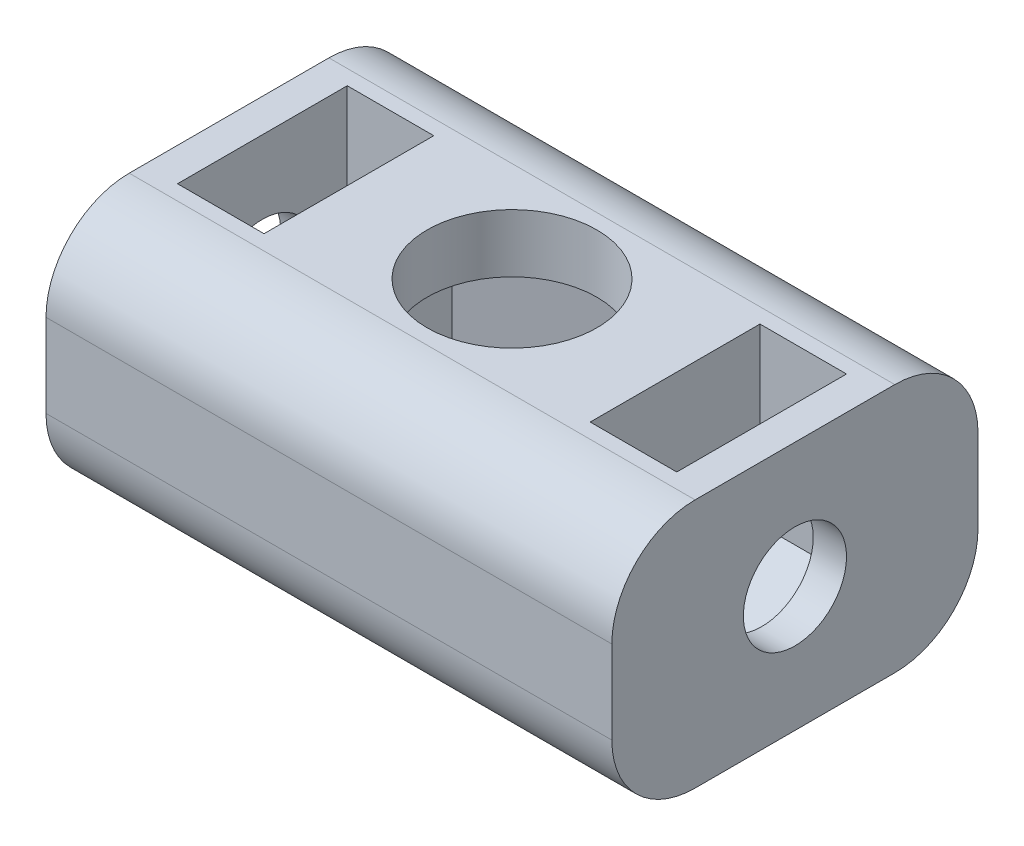
ISO-10303-21;
HEADER;
FILE_DESCRIPTION(('STEP AP214'),'2;1');
FILE_NAME('part.step','',(''),(''),'','','');
FILE_SCHEMA(('AUTOMOTIVE_DESIGN { 1 0 10303 214 1 1 1 1 }'));
ENDSEC;
DATA;
#1=APPLICATION_CONTEXT('core data for automotive mechanical design processes');
#2=APPLICATION_PROTOCOL_DEFINITION('international standard','automotive_design',2000,#1);
#3=PRODUCT_CONTEXT('',#1,'mechanical');
#4=PRODUCT('Part','Part','',(#3));
#5=PRODUCT_RELATED_PRODUCT_CATEGORY('part','',(#4));
#6=PRODUCT_DEFINITION_FORMATION('','',#4);
#7=PRODUCT_DEFINITION_CONTEXT('part definition',#1,'design');
#8=PRODUCT_DEFINITION('design','',#6,#7);
#9=PRODUCT_DEFINITION_SHAPE('','',#8);
#10=(LENGTH_UNIT() NAMED_UNIT(*) SI_UNIT(.MILLI.,.METRE.));
#11=(NAMED_UNIT(*) PLANE_ANGLE_UNIT() SI_UNIT($,.RADIAN.));
#12=(NAMED_UNIT(*) SI_UNIT($,.STERADIAN.) SOLID_ANGLE_UNIT());
#13=UNCERTAINTY_MEASURE_WITH_UNIT(LENGTH_MEASURE(1.E-05),#10,'distance_accuracy_value','');
#14=(GEOMETRIC_REPRESENTATION_CONTEXT(3) GLOBAL_UNCERTAINTY_ASSIGNED_CONTEXT((#13)) GLOBAL_UNIT_ASSIGNED_CONTEXT((#10,
#11,#12)) REPRESENTATION_CONTEXT('',''));
#15=CARTESIAN_POINT('',(0.,0.,0.));
#16=DIRECTION('',(0.,0.,1.));
#17=DIRECTION('',(1.,0.,0.));
#18=AXIS2_PLACEMENT_3D('',#15,#16,#17);
#19=CARTESIAN_POINT('',(17.,15.,-11.));
#20=DIRECTION('',(0.,-1.,0.));
#21=DIRECTION('',(0.,0.,-1.));
#22=AXIS2_PLACEMENT_3D('',#19,#20,#21);
#23=CYLINDRICAL_SURFACE('',#22,5.1);
#24=CARTESIAN_POINT('',(17.,0.,-11.));
#25=DIRECTION('',(0.,1.,0.));
#26=DIRECTION('',(0.,0.,1.));
#27=AXIS2_PLACEMENT_3D('',#24,#25,#26);
#28=CIRCLE('',#27,5.1);
#29=CARTESIAN_POINT('',(17.,0.,-5.9));
#30=VERTEX_POINT('',#29);
#31=EDGE_CURVE('E384',#30,#30,#28,.T.);
#32=ORIENTED_EDGE('',*,*,#31,.F.);
#33=EDGE_LOOP('',(#32));
#34=FACE_BOUND('',#33,.T.);
#35=CARTESIAN_POINT('',(17.,3.5,-11.));
#36=DIRECTION('',(0.,1.,0.));
#37=DIRECTION('',(0.,0.,1.));
#38=AXIS2_PLACEMENT_3D('',#35,#36,#37);
#39=CIRCLE('',#38,5.1);
#40=CARTESIAN_POINT('',(17.,3.5,-5.9));
#41=VERTEX_POINT('',#40);
#42=EDGE_CURVE('E215',#41,#41,#39,.T.);
#43=ORIENTED_EDGE('',*,*,#42,.T.);
#44=EDGE_LOOP('',(#43));
#45=FACE_BOUND('',#44,.T.);
#46=ADVANCED_FACE('F39',(#34,#45),#23,.F.);
#47=CARTESIAN_POINT('',(0.,15.,0.));
#48=DIRECTION('',(0.,-1.,0.));
#49=DIRECTION('',(0.,0.,-1.));
#50=AXIS2_PLACEMENT_3D('',#47,#48,#49);
#51=PLANE('',#50);
#52=DIRECTION('',(0.,0.,-1.));
#53=VECTOR('',#52,1.);
#54=CARTESIAN_POINT('',(7.19999999999999,15.,-16.1));
#55=LINE('',#54,#53);
#56=CARTESIAN_POINT('',(7.2,15.,-5.9));
#57=VERTEX_POINT('',#56);
#58=CARTESIAN_POINT('',(7.19999999999999,15.,-16.1));
#59=VERTEX_POINT('',#58);
#60=EDGE_CURVE('E355',#57,#59,#55,.T.);
#61=ORIENTED_EDGE('',*,*,#60,.F.);
#62=DIRECTION('',(-1.,0.,0.));
#63=VECTOR('',#62,1.);
#64=CARTESIAN_POINT('',(7.2,15.,-5.9));
#65=LINE('',#64,#63);
#66=CARTESIAN_POINT('',(2.,15.,-5.9));
#67=VERTEX_POINT('',#66);
#68=EDGE_CURVE('E388',#57,#67,#65,.T.);
#69=ORIENTED_EDGE('',*,*,#68,.T.);
#70=DIRECTION('',(0.,0.,-1.));
#71=VECTOR('',#70,1.);
#72=CARTESIAN_POINT('',(1.99999999999999,15.,-16.1));
#73=LINE('',#72,#71);
#74=CARTESIAN_POINT('',(1.99999999999999,15.,-16.1));
#75=VERTEX_POINT('',#74);
#76=EDGE_CURVE('E374',#67,#75,#73,.T.);
#77=ORIENTED_EDGE('',*,*,#76,.T.);
#78=DIRECTION('',(-1.,0.,0.));
#79=VECTOR('',#78,1.);
#80=CARTESIAN_POINT('',(7.19999999999999,15.,-16.1));
#81=LINE('',#80,#79);
#82=EDGE_CURVE('E385',#59,#75,#81,.T.);
#83=ORIENTED_EDGE('',*,*,#82,.F.);
#84=EDGE_LOOP('',(#61,#69,#77,#83));
#85=FACE_BOUND('',#84,.T.);
#86=DIRECTION('',(0.,0.,1.));
#87=VECTOR('',#86,1.);
#88=CARTESIAN_POINT('',(0.,15.,0.));
#89=LINE('',#88,#87);
#90=CARTESIAN_POINT('',(0.,15.,-17.));
#91=VERTEX_POINT('',#90);
#92=CARTESIAN_POINT('',(0.,15.,-5.));
#93=VERTEX_POINT('',#92);
#94=EDGE_CURVE('E406',#91,#93,#89,.T.);
#95=ORIENTED_EDGE('',*,*,#94,.T.);
#96=DIRECTION('',(1.,0.,0.));
#97=VECTOR('',#96,1.);
#98=CARTESIAN_POINT('',(0.,15.,-5.));
#99=LINE('',#98,#97);
#100=CARTESIAN_POINT('',(34.,15.,-5.));
#101=VERTEX_POINT('',#100);
#102=EDGE_CURVE('E11',#93,#101,#99,.T.);
#103=ORIENTED_EDGE('',*,*,#102,.T.);
#104=DIRECTION('',(0.,0.,-1.));
#105=VECTOR('',#104,1.);
#106=CARTESIAN_POINT('',(34.,15.,0.));
#107=LINE('',#106,#105);
#108=CARTESIAN_POINT('',(34.,15.,-17.));
#109=VERTEX_POINT('',#108);
#110=EDGE_CURVE('E410',#101,#109,#107,.T.);
#111=ORIENTED_EDGE('',*,*,#110,.T.);
#112=DIRECTION('',(-1.,0.,0.));
#113=VECTOR('',#112,1.);
#114=CARTESIAN_POINT('',(0.,15.,-17.));
#115=LINE('',#114,#113);
#116=EDGE_CURVE('E48',#109,#91,#115,.T.);
#117=ORIENTED_EDGE('',*,*,#116,.T.);
#118=EDGE_LOOP('',(#95,#103,#111,#117));
#119=FACE_BOUND('',#118,.T.);
#120=CARTESIAN_POINT('',(17.,15.,-11.));
#121=DIRECTION('',(0.,1.,0.));
#122=DIRECTION('',(0.,0.,1.));
#123=AXIS2_PLACEMENT_3D('',#120,#121,#122);
#124=CIRCLE('',#123,5.1);
#125=CARTESIAN_POINT('',(17.,15.,-5.9));
#126=VERTEX_POINT('',#125);
#127=EDGE_CURVE('E398',#126,#126,#124,.T.);
#128=ORIENTED_EDGE('',*,*,#127,.F.);
#129=EDGE_LOOP('',(#128));
#130=FACE_BOUND('',#129,.T.);
#131=DIRECTION('',(0.,0.,1.));
#132=VECTOR('',#131,1.);
#133=CARTESIAN_POINT('',(26.8,15.,-5.9));
#134=LINE('',#133,#132);
#135=CARTESIAN_POINT('',(26.8,15.,-16.1));
#136=VERTEX_POINT('',#135);
#137=CARTESIAN_POINT('',(26.8,15.,-5.9));
#138=VERTEX_POINT('',#137);
#139=EDGE_CURVE('E284',#136,#138,#134,.T.);
#140=ORIENTED_EDGE('',*,*,#139,.F.);
#141=DIRECTION('',(1.,0.,0.));
#142=VECTOR('',#141,1.);
#143=CARTESIAN_POINT('',(26.8,15.,-16.1));
#144=LINE('',#143,#142);
#145=CARTESIAN_POINT('',(32.,15.,-16.1));
#146=VERTEX_POINT('',#145);
#147=EDGE_CURVE('E326',#136,#146,#144,.T.);
#148=ORIENTED_EDGE('',*,*,#147,.T.);
#149=DIRECTION('',(0.,0.,1.));
#150=VECTOR('',#149,1.);
#151=CARTESIAN_POINT('',(32.,15.,-5.9));
#152=LINE('',#151,#150);
#153=CARTESIAN_POINT('',(32.,15.,-5.9));
#154=VERTEX_POINT('',#153);
#155=EDGE_CURVE('E306',#146,#154,#152,.T.);
#156=ORIENTED_EDGE('',*,*,#155,.T.);
#157=DIRECTION('',(1.,0.,0.));
#158=VECTOR('',#157,1.);
#159=CARTESIAN_POINT('',(26.8,15.,-5.9));
#160=LINE('',#159,#158);
#161=EDGE_CURVE('E305',#138,#154,#160,.T.);
#162=ORIENTED_EDGE('',*,*,#161,.F.);
#163=EDGE_LOOP('',(#140,#148,#156,#162));
#164=FACE_BOUND('',#163,.T.);
#165=ADVANCED_FACE('F491',(#85,#119,#130,#164),#51,.F.);
#166=CARTESIAN_POINT('',(0.,0.,0.));
#167=DIRECTION('',(0.,-1.,0.));
#168=DIRECTION('',(0.,0.,-1.));
#169=AXIS2_PLACEMENT_3D('',#166,#167,#168);
#170=PLANE('',#169);
#171=DIRECTION('',(0.,0.,-1.));
#172=VECTOR('',#171,1.);
#173=CARTESIAN_POINT('',(34.,0.,0.));
#174=LINE('',#173,#172);
#175=CARTESIAN_POINT('',(34.,0.,-5.));
#176=VERTEX_POINT('',#175);
#177=CARTESIAN_POINT('',(34.,0.,-17.));
#178=VERTEX_POINT('',#177);
#179=EDGE_CURVE('E411',#176,#178,#174,.T.);
#180=ORIENTED_EDGE('',*,*,#179,.F.);
#181=DIRECTION('',(1.,0.,0.));
#182=VECTOR('',#181,1.);
#183=CARTESIAN_POINT('',(0.,0.,-5.));
#184=LINE('',#183,#182);
#185=CARTESIAN_POINT('',(0.,0.,-5.));
#186=VERTEX_POINT('',#185);
#187=EDGE_CURVE('E469',#176,#186,#184,.F.);
#188=ORIENTED_EDGE('',*,*,#187,.T.);
#189=DIRECTION('',(0.,0.,1.));
#190=VECTOR('',#189,1.);
#191=CARTESIAN_POINT('',(0.,0.,0.));
#192=LINE('',#191,#190);
#193=CARTESIAN_POINT('',(0.,0.,-17.));
#194=VERTEX_POINT('',#193);
#195=EDGE_CURVE('E402',#194,#186,#192,.T.);
#196=ORIENTED_EDGE('',*,*,#195,.F.);
#197=DIRECTION('',(-1.,0.,0.));
#198=VECTOR('',#197,1.);
#199=CARTESIAN_POINT('',(34.,0.,-17.));
#200=LINE('',#199,#198);
#201=EDGE_CURVE('E466',#194,#178,#200,.F.);
#202=ORIENTED_EDGE('',*,*,#201,.T.);
#203=EDGE_LOOP('',(#180,#188,#196,#202));
#204=FACE_BOUND('',#203,.T.);
#205=ORIENTED_EDGE('',*,*,#31,.T.);
#206=EDGE_LOOP('',(#205));
#207=FACE_BOUND('',#206,.T.);
#208=ADVANCED_FACE('F514',(#204,#207),#170,.T.);
#209=CARTESIAN_POINT('',(0.,15.,0.));
#210=DIRECTION('',(1.,0.,0.));
#211=DIRECTION('',(0.,0.,-1.));
#212=AXIS2_PLACEMENT_3D('',#209,#210,#211);
#213=PLANE('',#212);
#214=CARTESIAN_POINT('',(0.,7.5,-11.));
#215=DIRECTION('',(-1.,0.,0.));
#216=DIRECTION('',(0.,0.,1.));
#217=AXIS2_PLACEMENT_3D('',#214,#215,#216);
#218=CIRCLE('',#217,3.1);
#219=CARTESIAN_POINT('',(0.,7.5,-7.89999999999999));
#220=VERTEX_POINT('',#219);
#221=EDGE_CURVE('E447',#220,#220,#218,.T.);
#222=ORIENTED_EDGE('',*,*,#221,.F.);
#223=EDGE_LOOP('',(#222));
#224=FACE_BOUND('',#223,.T.);
#225=ORIENTED_EDGE('',*,*,#195,.T.);
#226=CARTESIAN_POINT('',(0.,5.,-5.));
#227=DIRECTION('',(1.,0.,0.));
#228=DIRECTION('',(0.,0.,-1.));
#229=AXIS2_PLACEMENT_3D('',#226,#227,#228);
#230=CIRCLE('',#229,5.);
#231=CARTESIAN_POINT('',(0.,5.,0.));
#232=VERTEX_POINT('',#231);
#233=EDGE_CURVE('E479',#186,#232,#230,.F.);
#234=ORIENTED_EDGE('',*,*,#233,.T.);
#235=DIRECTION('',(0.,-1.,0.));
#236=VECTOR('',#235,1.);
#237=CARTESIAN_POINT('',(0.,15.,0.));
#238=LINE('',#237,#236);
#239=CARTESIAN_POINT('',(0.,10.,0.));
#240=VERTEX_POINT('',#239);
#241=EDGE_CURVE('E432',#240,#232,#238,.T.);
#242=ORIENTED_EDGE('',*,*,#241,.F.);
#243=CARTESIAN_POINT('',(0.,10.,-5.));
#244=DIRECTION('',(1.,0.,0.));
#245=DIRECTION('',(0.,0.,-1.));
#246=AXIS2_PLACEMENT_3D('',#243,#244,#245);
#247=CIRCLE('',#246,5.);
#248=EDGE_CURVE('E474',#240,#93,#247,.F.);
#249=ORIENTED_EDGE('',*,*,#248,.T.);
#250=ORIENTED_EDGE('',*,*,#94,.F.);
#251=CARTESIAN_POINT('',(0.,10.,-17.));
#252=DIRECTION('',(1.,0.,0.));
#253=DIRECTION('',(0.,0.,-1.));
#254=AXIS2_PLACEMENT_3D('',#251,#252,#253);
#255=CIRCLE('',#254,5.);
#256=CARTESIAN_POINT('',(0.,10.,-22.));
#257=VERTEX_POINT('',#256);
#258=EDGE_CURVE('E63',#91,#257,#255,.F.);
#259=ORIENTED_EDGE('',*,*,#258,.T.);
#260=DIRECTION('',(0.,-1.,0.));
#261=VECTOR('',#260,1.);
#262=CARTESIAN_POINT('',(0.,15.,-22.));
#263=LINE('',#262,#261);
#264=CARTESIAN_POINT('',(0.,5.,-22.));
#265=VERTEX_POINT('',#264);
#266=EDGE_CURVE('E415',#257,#265,#263,.T.);
#267=ORIENTED_EDGE('',*,*,#266,.T.);
#268=CARTESIAN_POINT('',(0.,5.,-17.));
#269=DIRECTION('',(1.,0.,0.));
#270=DIRECTION('',(0.,0.,-1.));
#271=AXIS2_PLACEMENT_3D('',#268,#269,#270);
#272=CIRCLE('',#271,5.);
#273=EDGE_CURVE('E55',#265,#194,#272,.F.);
#274=ORIENTED_EDGE('',*,*,#273,.T.);
#275=EDGE_LOOP('',(#225,#234,#242,#249,#250,#259,#267,#274));
#276=FACE_BOUND('',#275,.T.);
#277=ADVANCED_FACE('F497',(#224,#276),#213,.F.);
#278=CARTESIAN_POINT('',(0.,15.,0.));
#279=DIRECTION('',(0.,0.,-1.));
#280=DIRECTION('',(-1.,0.,0.));
#281=AXIS2_PLACEMENT_3D('',#278,#279,#280);
#282=PLANE('',#281);
#283=ORIENTED_EDGE('',*,*,#241,.T.);
#284=DIRECTION('',(1.,0.,0.));
#285=VECTOR('',#284,1.);
#286=CARTESIAN_POINT('',(34.,5.,0.));
#287=LINE('',#286,#285);
#288=CARTESIAN_POINT('',(34.,5.,0.));
#289=VERTEX_POINT('',#288);
#290=EDGE_CURVE('E450',#232,#289,#287,.T.);
#291=ORIENTED_EDGE('',*,*,#290,.T.);
#292=DIRECTION('',(0.,-1.,0.));
#293=VECTOR('',#292,1.);
#294=CARTESIAN_POINT('',(34.,15.,0.));
#295=LINE('',#294,#293);
#296=CARTESIAN_POINT('',(34.,10.,0.));
#297=VERTEX_POINT('',#296);
#298=EDGE_CURVE('E428',#297,#289,#295,.T.);
#299=ORIENTED_EDGE('',*,*,#298,.F.);
#300=DIRECTION('',(1.,0.,0.));
#301=VECTOR('',#300,1.);
#302=CARTESIAN_POINT('',(0.,10.,0.));
#303=LINE('',#302,#301);
#304=EDGE_CURVE('E436',#297,#240,#303,.F.);
#305=ORIENTED_EDGE('',*,*,#304,.T.);
#306=EDGE_LOOP('',(#283,#291,#299,#305));
#307=FACE_BOUND('',#306,.T.);
#308=ADVANCED_FACE('F523',(#307),#282,.F.);
#309=CARTESIAN_POINT('',(34.,15.,0.));
#310=DIRECTION('',(-1.,0.,0.));
#311=DIRECTION('',(0.,0.,1.));
#312=AXIS2_PLACEMENT_3D('',#309,#310,#311);
#313=PLANE('',#312);
#314=CARTESIAN_POINT('',(34.,7.5,-11.));
#315=DIRECTION('',(1.,0.,0.));
#316=DIRECTION('',(0.,0.,-1.));
#317=AXIS2_PLACEMENT_3D('',#314,#315,#316);
#318=CIRCLE('',#317,3.1);
#319=CARTESIAN_POINT('',(34.,7.5,-14.1));
#320=VERTEX_POINT('',#319);
#321=EDGE_CURVE('E237',#320,#320,#318,.T.);
#322=ORIENTED_EDGE('',*,*,#321,.F.);
#323=EDGE_LOOP('',(#322));
#324=FACE_BOUND('',#323,.T.);
#325=ORIENTED_EDGE('',*,*,#298,.T.);
#326=CARTESIAN_POINT('',(34.,5.,-5.));
#327=DIRECTION('',(-1.,0.,0.));
#328=DIRECTION('',(0.,0.,1.));
#329=AXIS2_PLACEMENT_3D('',#326,#327,#328);
#330=CIRCLE('',#329,5.);
#331=EDGE_CURVE('E463',#289,#176,#330,.F.);
#332=ORIENTED_EDGE('',*,*,#331,.T.);
#333=ORIENTED_EDGE('',*,*,#179,.T.);
#334=CARTESIAN_POINT('',(34.,5.,-17.));
#335=DIRECTION('',(-1.,0.,0.));
#336=DIRECTION('',(0.,0.,1.));
#337=AXIS2_PLACEMENT_3D('',#334,#335,#336);
#338=CIRCLE('',#337,5.);
#339=CARTESIAN_POINT('',(34.,5.,-22.));
#340=VERTEX_POINT('',#339);
#341=EDGE_CURVE('E460',#178,#340,#338,.F.);
#342=ORIENTED_EDGE('',*,*,#341,.T.);
#343=DIRECTION('',(0.,-1.,0.));
#344=VECTOR('',#343,1.);
#345=CARTESIAN_POINT('',(34.,15.,-22.));
#346=LINE('',#345,#344);
#347=CARTESIAN_POINT('',(34.,10.,-22.));
#348=VERTEX_POINT('',#347);
#349=EDGE_CURVE('E424',#348,#340,#346,.T.);
#350=ORIENTED_EDGE('',*,*,#349,.F.);
#351=CARTESIAN_POINT('',(34.,10.,-17.));
#352=DIRECTION('',(-1.,0.,0.));
#353=DIRECTION('',(0.,0.,1.));
#354=AXIS2_PLACEMENT_3D('',#351,#352,#353);
#355=CIRCLE('',#354,5.);
#356=EDGE_CURVE('E454',#348,#109,#355,.F.);
#357=ORIENTED_EDGE('',*,*,#356,.T.);
#358=ORIENTED_EDGE('',*,*,#110,.F.);
#359=CARTESIAN_POINT('',(34.,10.,-5.));
#360=DIRECTION('',(-1.,0.,0.));
#361=DIRECTION('',(0.,0.,1.));
#362=AXIS2_PLACEMENT_3D('',#359,#360,#361);
#363=CIRCLE('',#362,5.);
#364=EDGE_CURVE('E457',#101,#297,#363,.F.);
#365=ORIENTED_EDGE('',*,*,#364,.T.);
#366=EDGE_LOOP('',(#325,#332,#333,#342,#350,#357,#358,#365));
#367=FACE_BOUND('',#366,.T.);
#368=ADVANCED_FACE('F504',(#324,#367),#313,.F.);
#369=CARTESIAN_POINT('',(0.,15.,-22.));
#370=DIRECTION('',(0.,0.,1.));
#371=DIRECTION('',(1.,0.,0.));
#372=AXIS2_PLACEMENT_3D('',#369,#370,#371);
#373=PLANE('',#372);
#374=ORIENTED_EDGE('',*,*,#349,.T.);
#375=DIRECTION('',(-1.,0.,0.));
#376=VECTOR('',#375,1.);
#377=CARTESIAN_POINT('',(0.,5.,-22.));
#378=LINE('',#377,#376);
#379=EDGE_CURVE('E485',#340,#265,#378,.T.);
#380=ORIENTED_EDGE('',*,*,#379,.T.);
#381=ORIENTED_EDGE('',*,*,#266,.F.);
#382=DIRECTION('',(-1.,0.,0.));
#383=VECTOR('',#382,1.);
#384=CARTESIAN_POINT('',(0.,10.,-22.));
#385=LINE('',#384,#383);
#386=EDGE_CURVE('E482',#257,#348,#385,.F.);
#387=ORIENTED_EDGE('',*,*,#386,.T.);
#388=EDGE_LOOP('',(#374,#380,#381,#387));
#389=FACE_BOUND('',#388,.T.);
#390=ADVANCED_FACE('F509',(#389),#373,.F.);
#391=CARTESIAN_POINT('',(17.,11.5,-11.));
#392=DIRECTION('',(0.,1.,0.));
#393=DIRECTION('',(0.,0.,1.));
#394=AXIS2_PLACEMENT_3D('',#391,#392,#393);
#395=CIRCLE('',#394,5.1);
#396=CARTESIAN_POINT('',(17.,11.5,-5.9));
#397=VERTEX_POINT('',#396);
#398=EDGE_CURVE('E311',#397,#397,#395,.T.);
#399=ORIENTED_EDGE('',*,*,#398,.F.);
#400=EDGE_LOOP('',(#399));
#401=FACE_BOUND('',#400,.T.);
#402=ORIENTED_EDGE('',*,*,#127,.T.);
#403=EDGE_LOOP('',(#402));
#404=FACE_BOUND('',#403,.T.);
#405=ADVANCED_FACE('F537',(#401,#404),#23,.F.);
#406=CARTESIAN_POINT('',(7.19999999999999,4.5555136271329,-16.1));
#407=DIRECTION('',(0.,-0.866025403784439,-0.5));
#408=DIRECTION('',(0.,0.5,-0.866025403784439));
#409=AXIS2_PLACEMENT_3D('',#406,#407,#408);
#410=PLANE('',#409);
#411=DIRECTION('',(0.,-0.5,0.866025403784439));
#412=VECTOR('',#411,1.);
#413=CARTESIAN_POINT('',(1.99999999999999,4.5555136271329,-16.1));
#414=LINE('',#413,#412);
#415=CARTESIAN_POINT('',(1.99999999999999,4.5555136271329,-16.1));
#416=VERTEX_POINT('',#415);
#417=CARTESIAN_POINT('',(2.,1.61102725426582,-11.));
#418=VERTEX_POINT('',#417);
#419=EDGE_CURVE('E330',#416,#418,#414,.T.);
#420=ORIENTED_EDGE('',*,*,#419,.T.);
#421=DIRECTION('',(-1.,0.,0.));
#422=VECTOR('',#421,1.);
#423=CARTESIAN_POINT('',(7.2,1.61102725426582,-11.));
#424=LINE('',#423,#422);
#425=CARTESIAN_POINT('',(7.2,1.61102725426582,-11.));
#426=VERTEX_POINT('',#425);
#427=EDGE_CURVE('E362',#426,#418,#424,.T.);
#428=ORIENTED_EDGE('',*,*,#427,.F.);
#429=DIRECTION('',(0.,-0.5,0.866025403784439));
#430=VECTOR('',#429,1.);
#431=CARTESIAN_POINT('',(7.19999999999999,4.5555136271329,-16.1));
#432=LINE('',#431,#430);
#433=CARTESIAN_POINT('',(7.19999999999999,4.5555136271329,-16.1));
#434=VERTEX_POINT('',#433);
#435=EDGE_CURVE('E343',#434,#426,#432,.T.);
#436=ORIENTED_EDGE('',*,*,#435,.F.);
#437=DIRECTION('',(-1.,0.,0.));
#438=VECTOR('',#437,1.);
#439=CARTESIAN_POINT('',(7.19999999999999,4.5555136271329,-16.1));
#440=LINE('',#439,#438);
#441=EDGE_CURVE('E381',#434,#416,#440,.T.);
#442=ORIENTED_EDGE('',*,*,#441,.T.);
#443=EDGE_LOOP('',(#420,#428,#436,#442));
#444=FACE_BOUND('',#443,.T.);
#445=ADVANCED_FACE('F547',(#444),#410,.F.);
#446=CARTESIAN_POINT('',(7.19999999999999,10.4444863728671,-16.1));
#447=DIRECTION('',(0.,0.,-1.));
#448=DIRECTION('',(0.,1.,0.));
#449=AXIS2_PLACEMENT_3D('',#446,#447,#448);
#450=PLANE('',#449);
#451=DIRECTION('',(0.,-1.,0.));
#452=VECTOR('',#451,1.);
#453=CARTESIAN_POINT('',(1.99999999999999,10.4444863728671,-16.1));
#454=LINE('',#453,#452);
#455=EDGE_CURVE('E348',#75,#416,#454,.T.);
#456=ORIENTED_EDGE('',*,*,#455,.T.);
#457=ORIENTED_EDGE('',*,*,#441,.F.);
#458=DIRECTION('',(0.,-1.,0.));
#459=VECTOR('',#458,1.);
#460=CARTESIAN_POINT('',(7.19999999999999,10.4444863728671,-16.1));
#461=LINE('',#460,#459);
#462=EDGE_CURVE('E359',#59,#434,#461,.T.);
#463=ORIENTED_EDGE('',*,*,#462,.F.);
#464=ORIENTED_EDGE('',*,*,#82,.T.);
#465=EDGE_LOOP('',(#456,#457,#463,#464));
#466=FACE_BOUND('',#465,.T.);
#467=ADVANCED_FACE('F553',(#466),#450,.F.);
#468=CARTESIAN_POINT('',(7.2,15.,-5.9));
#469=DIRECTION('',(0.,0.,1.));
#470=DIRECTION('',(0.,-1.,0.));
#471=AXIS2_PLACEMENT_3D('',#468,#469,#470);
#472=PLANE('',#471);
#473=DIRECTION('',(0.,1.,0.));
#474=VECTOR('',#473,1.);
#475=CARTESIAN_POINT('',(2.,15.,-5.9));
#476=LINE('',#475,#474);
#477=CARTESIAN_POINT('',(2.,4.55551362713291,-5.9));
#478=VERTEX_POINT('',#477);
#479=EDGE_CURVE('E370',#478,#67,#476,.T.);
#480=ORIENTED_EDGE('',*,*,#479,.T.);
#481=ORIENTED_EDGE('',*,*,#68,.F.);
#482=DIRECTION('',(0.,1.,0.));
#483=VECTOR('',#482,1.);
#484=CARTESIAN_POINT('',(7.2,4.55551362713291,-5.9));
#485=LINE('',#484,#483);
#486=CARTESIAN_POINT('',(7.2,4.55551362713291,-5.9));
#487=VERTEX_POINT('',#486);
#488=EDGE_CURVE('E352',#487,#57,#485,.T.);
#489=ORIENTED_EDGE('',*,*,#488,.F.);
#490=DIRECTION('',(-1.,0.,0.));
#491=VECTOR('',#490,1.);
#492=CARTESIAN_POINT('',(7.2,4.55551362713291,-5.9));
#493=LINE('',#492,#491);
#494=EDGE_CURVE('E392',#487,#478,#493,.T.);
#495=ORIENTED_EDGE('',*,*,#494,.T.);
#496=EDGE_LOOP('',(#480,#481,#489,#495));
#497=FACE_BOUND('',#496,.T.);
#498=ADVANCED_FACE('F603',(#497),#472,.F.);
#499=CARTESIAN_POINT('',(7.2,1.61102725426582,-11.));
#500=DIRECTION('',(0.,-0.866025403784438,0.500000000000001));
#501=DIRECTION('',(0.,-0.500000000000001,-0.866025403784438));
#502=AXIS2_PLACEMENT_3D('',#499,#500,#501);
#503=PLANE('',#502);
#504=DIRECTION('',(0.,0.500000000000001,0.866025403784438));
#505=VECTOR('',#504,1.);
#506=CARTESIAN_POINT('',(2.,1.61102725426582,-11.));
#507=LINE('',#506,#505);
#508=EDGE_CURVE('E366',#418,#478,#507,.T.);
#509=ORIENTED_EDGE('',*,*,#508,.T.);
#510=ORIENTED_EDGE('',*,*,#494,.F.);
#511=DIRECTION('',(0.,0.500000000000001,0.866025403784438));
#512=VECTOR('',#511,1.);
#513=CARTESIAN_POINT('',(7.2,1.61102725426582,-11.));
#514=LINE('',#513,#512);
#515=EDGE_CURVE('E347',#426,#487,#514,.T.);
#516=ORIENTED_EDGE('',*,*,#515,.F.);
#517=ORIENTED_EDGE('',*,*,#427,.T.);
#518=EDGE_LOOP('',(#509,#510,#516,#517));
#519=FACE_BOUND('',#518,.T.);
#520=ADVANCED_FACE('F596',(#519),#503,.F.);
#521=CARTESIAN_POINT('',(7.2,0.,0.));
#522=DIRECTION('',(-1.,0.,0.));
#523=DIRECTION('',(0.,0.,1.));
#524=AXIS2_PLACEMENT_3D('',#521,#522,#523);
#525=PLANE('',#524);
#526=ORIENTED_EDGE('',*,*,#435,.T.);
#527=ORIENTED_EDGE('',*,*,#515,.T.);
#528=ORIENTED_EDGE('',*,*,#488,.T.);
#529=ORIENTED_EDGE('',*,*,#60,.T.);
#530=ORIENTED_EDGE('',*,*,#462,.T.);
#531=EDGE_LOOP('',(#526,#527,#528,#529,#530));
#532=FACE_BOUND('',#531,.T.);
#533=ADVANCED_FACE('F593',(#532),#525,.T.);
#534=CARTESIAN_POINT('',(2.,0.,0.));
#535=DIRECTION('',(-1.,0.,0.));
#536=DIRECTION('',(0.,0.,1.));
#537=AXIS2_PLACEMENT_3D('',#534,#535,#536);
#538=PLANE('',#537);
#539=CARTESIAN_POINT('',(2.,7.5,-11.));
#540=DIRECTION('',(-1.,0.,0.));
#541=DIRECTION('',(0.,0.,1.));
#542=AXIS2_PLACEMENT_3D('',#539,#540,#541);
#543=CIRCLE('',#542,3.1);
#544=CARTESIAN_POINT('',(2.,7.5,-7.89999999999999));
#545=VERTEX_POINT('',#544);
#546=EDGE_CURVE('E443',#545,#545,#543,.T.);
#547=ORIENTED_EDGE('',*,*,#546,.T.);
#548=EDGE_LOOP('',(#547));
#549=FACE_BOUND('',#548,.T.);
#550=ORIENTED_EDGE('',*,*,#419,.F.);
#551=ORIENTED_EDGE('',*,*,#455,.F.);
#552=ORIENTED_EDGE('',*,*,#76,.F.);
#553=ORIENTED_EDGE('',*,*,#479,.F.);
#554=ORIENTED_EDGE('',*,*,#508,.F.);
#555=EDGE_LOOP('',(#550,#551,#552,#553,#554));
#556=FACE_BOUND('',#555,.T.);
#557=ADVANCED_FACE('F587',(#549,#556),#538,.F.);
#558=CARTESIAN_POINT('',(26.8,4.5555136271329,-16.1));
#559=DIRECTION('',(0.,0.,-1.));
#560=DIRECTION('',(-1.,0.,0.));
#561=AXIS2_PLACEMENT_3D('',#558,#559,#560);
#562=PLANE('',#561);
#563=DIRECTION('',(0.,1.,0.));
#564=VECTOR('',#563,1.);
#565=CARTESIAN_POINT('',(32.,4.5555136271329,-16.1));
#566=LINE('',#565,#564);
#567=CARTESIAN_POINT('',(32.,4.5555136271329,-16.1));
#568=VERTEX_POINT('',#567);
#569=EDGE_CURVE('E289',#568,#146,#566,.T.);
#570=ORIENTED_EDGE('',*,*,#569,.T.);
#571=ORIENTED_EDGE('',*,*,#147,.F.);
#572=DIRECTION('',(0.,1.,0.));
#573=VECTOR('',#572,1.);
#574=CARTESIAN_POINT('',(26.8,4.5555136271329,-16.1));
#575=LINE('',#574,#573);
#576=CARTESIAN_POINT('',(26.8,4.5555136271329,-16.1));
#577=VERTEX_POINT('',#576);
#578=EDGE_CURVE('E301',#577,#136,#575,.T.);
#579=ORIENTED_EDGE('',*,*,#578,.F.);
#580=DIRECTION('',(1.,0.,0.));
#581=VECTOR('',#580,1.);
#582=CARTESIAN_POINT('',(26.8,4.5555136271329,-16.1));
#583=LINE('',#582,#581);
#584=EDGE_CURVE('E331',#577,#568,#583,.T.);
#585=ORIENTED_EDGE('',*,*,#584,.T.);
#586=EDGE_LOOP('',(#570,#571,#579,#585));
#587=FACE_BOUND('',#586,.T.);
#588=ADVANCED_FACE('F567',(#587),#562,.F.);
#589=CARTESIAN_POINT('',(26.8,4.5555136271329,-16.1));
#590=DIRECTION('',(0.,-0.866025403784439,-0.5));
#591=DIRECTION('',(0.,0.5,-0.866025403784439));
#592=AXIS2_PLACEMENT_3D('',#589,#590,#591);
#593=PLANE('',#592);
#594=DIRECTION('',(0.,0.5,-0.866025403784439));
#595=VECTOR('',#594,1.);
#596=CARTESIAN_POINT('',(32.,4.5555136271329,-16.1));
#597=LINE('',#596,#595);
#598=CARTESIAN_POINT('',(32.,1.61102725426582,-11.));
#599=VERTEX_POINT('',#598);
#600=EDGE_CURVE('E319',#599,#568,#597,.T.);
#601=ORIENTED_EDGE('',*,*,#600,.T.);
#602=ORIENTED_EDGE('',*,*,#584,.F.);
#603=DIRECTION('',(0.,0.5,-0.866025403784439));
#604=VECTOR('',#603,1.);
#605=CARTESIAN_POINT('',(26.8,4.5555136271329,-16.1));
#606=LINE('',#605,#604);
#607=CARTESIAN_POINT('',(26.8,1.61102725426582,-11.));
#608=VERTEX_POINT('',#607);
#609=EDGE_CURVE('E297',#608,#577,#606,.T.);
#610=ORIENTED_EDGE('',*,*,#609,.F.);
#611=DIRECTION('',(1.,0.,0.));
#612=VECTOR('',#611,1.);
#613=CARTESIAN_POINT('',(26.8,1.61102725426582,-11.));
#614=LINE('',#613,#612);
#615=EDGE_CURVE('E334',#608,#599,#614,.T.);
#616=ORIENTED_EDGE('',*,*,#615,.T.);
#617=EDGE_LOOP('',(#601,#602,#610,#616));
#618=FACE_BOUND('',#617,.T.);
#619=ADVANCED_FACE('F579',(#618),#593,.F.);
#620=CARTESIAN_POINT('',(26.8,1.61102725426582,-11.));
#621=DIRECTION('',(0.,-0.866025403784438,0.500000000000001));
#622=DIRECTION('',(0.,-0.500000000000001,-0.866025403784438));
#623=AXIS2_PLACEMENT_3D('',#620,#621,#622);
#624=PLANE('',#623);
#625=DIRECTION('',(0.,-0.500000000000001,-0.866025403784438));
#626=VECTOR('',#625,1.);
#627=CARTESIAN_POINT('',(32.,1.61102725426582,-11.));
#628=LINE('',#627,#626);
#629=CARTESIAN_POINT('',(32.,4.55551362713291,-5.90000000000001));
#630=VERTEX_POINT('',#629);
#631=EDGE_CURVE('E315',#630,#599,#628,.T.);
#632=ORIENTED_EDGE('',*,*,#631,.T.);
#633=ORIENTED_EDGE('',*,*,#615,.F.);
#634=DIRECTION('',(0.,-0.500000000000001,-0.866025403784438));
#635=VECTOR('',#634,1.);
#636=CARTESIAN_POINT('',(26.8,1.61102725426582,-11.));
#637=LINE('',#636,#635);
#638=CARTESIAN_POINT('',(26.8,4.55551362713291,-5.90000000000001));
#639=VERTEX_POINT('',#638);
#640=EDGE_CURVE('E293',#639,#608,#637,.T.);
#641=ORIENTED_EDGE('',*,*,#640,.F.);
#642=DIRECTION('',(1.,0.,0.));
#643=VECTOR('',#642,1.);
#644=CARTESIAN_POINT('',(26.8,4.55551362713291,-5.90000000000001));
#645=LINE('',#644,#643);
#646=EDGE_CURVE('E337',#639,#630,#645,.T.);
#647=ORIENTED_EDGE('',*,*,#646,.T.);
#648=EDGE_LOOP('',(#632,#633,#641,#647));
#649=FACE_BOUND('',#648,.T.);
#650=ADVANCED_FACE('F577',(#649),#624,.F.);
#651=CARTESIAN_POINT('',(26.8,15.,-5.9));
#652=DIRECTION('',(0.,0.,1.));
#653=DIRECTION('',(0.,-1.,0.));
#654=AXIS2_PLACEMENT_3D('',#651,#652,#653);
#655=PLANE('',#654);
#656=DIRECTION('',(0.,-1.,0.));
#657=VECTOR('',#656,1.);
#658=CARTESIAN_POINT('',(32.,15.,-5.9));
#659=LINE('',#658,#657);
#660=EDGE_CURVE('E310',#154,#630,#659,.T.);
#661=ORIENTED_EDGE('',*,*,#660,.T.);
#662=ORIENTED_EDGE('',*,*,#646,.F.);
#663=DIRECTION('',(0.,-1.,0.));
#664=VECTOR('',#663,1.);
#665=CARTESIAN_POINT('',(26.8,15.,-5.9));
#666=LINE('',#665,#664);
#667=EDGE_CURVE('E288',#138,#639,#666,.T.);
#668=ORIENTED_EDGE('',*,*,#667,.F.);
#669=ORIENTED_EDGE('',*,*,#161,.T.);
#670=EDGE_LOOP('',(#661,#662,#668,#669));
#671=FACE_BOUND('',#670,.T.);
#672=ADVANCED_FACE('F574',(#671),#655,.F.);
#673=CARTESIAN_POINT('',(26.8,0.,0.));
#674=DIRECTION('',(1.,0.,0.));
#675=DIRECTION('',(0.,0.,-1.));
#676=AXIS2_PLACEMENT_3D('',#673,#674,#675);
#677=PLANE('',#676);
#678=ORIENTED_EDGE('',*,*,#139,.T.);
#679=ORIENTED_EDGE('',*,*,#667,.T.);
#680=ORIENTED_EDGE('',*,*,#640,.T.);
#681=ORIENTED_EDGE('',*,*,#609,.T.);
#682=ORIENTED_EDGE('',*,*,#578,.T.);
#683=EDGE_LOOP('',(#678,#679,#680,#681,#682));
#684=FACE_BOUND('',#683,.T.);
#685=ADVANCED_FACE('F563',(#684),#677,.T.);
#686=CARTESIAN_POINT('',(32.,0.,0.));
#687=DIRECTION('',(1.,0.,0.));
#688=DIRECTION('',(0.,0.,-1.));
#689=AXIS2_PLACEMENT_3D('',#686,#687,#688);
#690=PLANE('',#689);
#691=CARTESIAN_POINT('',(32.,7.5,-11.));
#692=DIRECTION('',(1.,0.,0.));
#693=DIRECTION('',(0.,0.,-1.));
#694=AXIS2_PLACEMENT_3D('',#691,#692,#693);
#695=CIRCLE('',#694,3.1);
#696=CARTESIAN_POINT('',(32.,7.5,-14.1));
#697=VERTEX_POINT('',#696);
#698=EDGE_CURVE('E233',#697,#697,#695,.T.);
#699=ORIENTED_EDGE('',*,*,#698,.T.);
#700=EDGE_LOOP('',(#699));
#701=FACE_BOUND('',#700,.T.);
#702=ORIENTED_EDGE('',*,*,#155,.F.);
#703=ORIENTED_EDGE('',*,*,#569,.F.);
#704=ORIENTED_EDGE('',*,*,#600,.F.);
#705=ORIENTED_EDGE('',*,*,#631,.F.);
#706=ORIENTED_EDGE('',*,*,#660,.F.);
#707=EDGE_LOOP('',(#702,#703,#704,#705,#706));
#708=FACE_BOUND('',#707,.T.);
#709=ADVANCED_FACE('F571',(#701,#708),#690,.F.);
#710=CARTESIAN_POINT('',(8.49999999999999,11.5,-15.9074772881118));
#711=DIRECTION('',(1.,0.,0.));
#712=DIRECTION('',(0.,0.,-1.));
#713=AXIS2_PLACEMENT_3D('',#710,#711,#712);
#714=PLANE('',#713);
#715=DIRECTION('',(0.,-1.,0.));
#716=VECTOR('',#715,1.);
#717=CARTESIAN_POINT('',(8.49999999999999,11.5,-15.9074772881118));
#718=LINE('',#717,#716);
#719=CARTESIAN_POINT('',(8.49999999999999,11.5,-15.9074772881118));
#720=VERTEX_POINT('',#719);
#721=CARTESIAN_POINT('',(8.49999999999999,3.5,-15.9074772881118));
#722=VERTEX_POINT('',#721);
#723=EDGE_CURVE('E270',#720,#722,#718,.T.);
#724=ORIENTED_EDGE('',*,*,#723,.F.);
#725=DIRECTION('',(0.,0.,1.));
#726=VECTOR('',#725,1.);
#727=CARTESIAN_POINT('',(8.49999999999999,11.5,-15.9074772881118));
#728=LINE('',#727,#726);
#729=CARTESIAN_POINT('',(8.5,11.5,-6.09252271188818));
#730=VERTEX_POINT('',#729);
#731=EDGE_CURVE('E212',#720,#730,#728,.T.);
#732=ORIENTED_EDGE('',*,*,#731,.T.);
#733=DIRECTION('',(0.,-1.,0.));
#734=VECTOR('',#733,1.);
#735=CARTESIAN_POINT('',(8.5,11.5,-6.09252271188818));
#736=LINE('',#735,#734);
#737=CARTESIAN_POINT('',(8.5,3.5,-6.09252271188818));
#738=VERTEX_POINT('',#737);
#739=EDGE_CURVE('E204',#730,#738,#736,.T.);
#740=ORIENTED_EDGE('',*,*,#739,.T.);
#741=DIRECTION('',(0.,0.,1.));
#742=VECTOR('',#741,1.);
#743=CARTESIAN_POINT('',(8.49999999999999,3.5,-15.9074772881118));
#744=LINE('',#743,#742);
#745=EDGE_CURVE('E209',#722,#738,#744,.T.);
#746=ORIENTED_EDGE('',*,*,#745,.F.);
#747=EDGE_LOOP('',(#724,#732,#740,#746));
#748=FACE_BOUND('',#747,.T.);
#749=ADVANCED_FACE('F207',(#748),#714,.T.);
#750=CARTESIAN_POINT('',(8.5,11.5,-6.09252271188818));
#751=DIRECTION('',(0.5,0.,-0.866025403784439));
#752=DIRECTION('',(-0.866025403784438,0.,-0.5));
#753=AXIS2_PLACEMENT_3D('',#750,#751,#752);
#754=PLANE('',#753);
#755=ORIENTED_EDGE('',*,*,#739,.F.);
#756=DIRECTION('',(0.866025403784438,0.,0.5));
#757=VECTOR('',#756,1.);
#758=CARTESIAN_POINT('',(8.5,11.5,-6.09252271188818));
#759=LINE('',#758,#757);
#760=CARTESIAN_POINT('',(17.,11.5,-1.18504542377636));
#761=VERTEX_POINT('',#760);
#762=EDGE_CURVE('E255',#730,#761,#759,.T.);
#763=ORIENTED_EDGE('',*,*,#762,.T.);
#764=DIRECTION('',(0.,-1.,0.));
#765=VECTOR('',#764,1.);
#766=CARTESIAN_POINT('',(17.,11.5,-1.18504542377636));
#767=LINE('',#766,#765);
#768=CARTESIAN_POINT('',(17.,3.5,-1.18504542377636));
#769=VERTEX_POINT('',#768);
#770=EDGE_CURVE('E216',#761,#769,#767,.T.);
#771=ORIENTED_EDGE('',*,*,#770,.T.);
#772=DIRECTION('',(0.866025403784438,0.,0.5));
#773=VECTOR('',#772,1.);
#774=CARTESIAN_POINT('',(8.5,3.5,-6.09252271188818));
#775=LINE('',#774,#773);
#776=EDGE_CURVE('E219',#738,#769,#775,.T.);
#777=ORIENTED_EDGE('',*,*,#776,.F.);
#778=EDGE_LOOP('',(#755,#763,#771,#777));
#779=FACE_BOUND('',#778,.T.);
#780=ADVANCED_FACE('F220',(#779),#754,.T.);
#781=CARTESIAN_POINT('',(17.,11.5,-1.18504542377636));
#782=DIRECTION('',(-0.5,0.,-0.866025403784439));
#783=DIRECTION('',(-0.866025403784439,0.,0.5));
#784=AXIS2_PLACEMENT_3D('',#781,#782,#783);
#785=PLANE('',#784);
#786=ORIENTED_EDGE('',*,*,#770,.F.);
#787=DIRECTION('',(0.866025403784439,0.,-0.5));
#788=VECTOR('',#787,1.);
#789=CARTESIAN_POINT('',(17.,11.5,-1.18504542377636));
#790=LINE('',#789,#788);
#791=CARTESIAN_POINT('',(25.5,11.5,-6.09252271188818));
#792=VERTEX_POINT('',#791);
#793=EDGE_CURVE('E258',#761,#792,#790,.T.);
#794=ORIENTED_EDGE('',*,*,#793,.T.);
#795=DIRECTION('',(0.,-1.,0.));
#796=VECTOR('',#795,1.);
#797=CARTESIAN_POINT('',(25.5,11.5,-6.09252271188818));
#798=LINE('',#797,#796);
#799=CARTESIAN_POINT('',(25.5,3.5,-6.09252271188818));
#800=VERTEX_POINT('',#799);
#801=EDGE_CURVE('E279',#792,#800,#798,.T.);
#802=ORIENTED_EDGE('',*,*,#801,.T.);
#803=DIRECTION('',(0.866025403784439,0.,-0.5));
#804=VECTOR('',#803,1.);
#805=CARTESIAN_POINT('',(17.,3.5,-1.18504542377636));
#806=LINE('',#805,#804);
#807=EDGE_CURVE('E226',#769,#800,#806,.T.);
#808=ORIENTED_EDGE('',*,*,#807,.F.);
#809=EDGE_LOOP('',(#786,#794,#802,#808));
#810=FACE_BOUND('',#809,.T.);
#811=ADVANCED_FACE('F693',(#810),#785,.T.);
#812=CARTESIAN_POINT('',(25.5,11.5,-6.09252271188818));
#813=DIRECTION('',(-1.,0.,0.));
#814=DIRECTION('',(0.,0.,1.));
#815=AXIS2_PLACEMENT_3D('',#812,#813,#814);
#816=PLANE('',#815);
#817=ORIENTED_EDGE('',*,*,#801,.F.);
#818=DIRECTION('',(0.,0.,-1.));
#819=VECTOR('',#818,1.);
#820=CARTESIAN_POINT('',(25.5,11.5,-6.09252271188818));
#821=LINE('',#820,#819);
#822=CARTESIAN_POINT('',(25.5,11.5,-15.9074772881118));
#823=VERTEX_POINT('',#822);
#824=EDGE_CURVE('E261',#792,#823,#821,.T.);
#825=ORIENTED_EDGE('',*,*,#824,.T.);
#826=DIRECTION('',(0.,-1.,0.));
#827=VECTOR('',#826,1.);
#828=CARTESIAN_POINT('',(25.5,11.5,-15.9074772881118));
#829=LINE('',#828,#827);
#830=CARTESIAN_POINT('',(25.5,3.5,-15.9074772881118));
#831=VERTEX_POINT('',#830);
#832=EDGE_CURVE('E276',#823,#831,#829,.T.);
#833=ORIENTED_EDGE('',*,*,#832,.T.);
#834=DIRECTION('',(0.,0.,-1.));
#835=VECTOR('',#834,1.);
#836=CARTESIAN_POINT('',(25.5,3.5,-6.09252271188818));
#837=LINE('',#836,#835);
#838=EDGE_CURVE('E244',#800,#831,#837,.T.);
#839=ORIENTED_EDGE('',*,*,#838,.F.);
#840=EDGE_LOOP('',(#817,#825,#833,#839));
#841=FACE_BOUND('',#840,.T.);
#842=ADVANCED_FACE('F702',(#841),#816,.T.);
#843=CARTESIAN_POINT('',(25.5,11.5,-15.9074772881118));
#844=DIRECTION('',(-0.5,0.,0.866025403784439));
#845=DIRECTION('',(0.866025403784439,0.,0.5));
#846=AXIS2_PLACEMENT_3D('',#843,#844,#845);
#847=PLANE('',#846);
#848=ORIENTED_EDGE('',*,*,#832,.F.);
#849=DIRECTION('',(-0.866025403784439,0.,-0.5));
#850=VECTOR('',#849,1.);
#851=CARTESIAN_POINT('',(25.5,11.5,-15.9074772881118));
#852=LINE('',#851,#850);
#853=CARTESIAN_POINT('',(17.,11.5,-20.8149545762237));
#854=VERTEX_POINT('',#853);
#855=EDGE_CURVE('E264',#823,#854,#852,.T.);
#856=ORIENTED_EDGE('',*,*,#855,.T.);
#857=DIRECTION('',(0.,-1.,0.));
#858=VECTOR('',#857,1.);
#859=CARTESIAN_POINT('',(17.,11.5,-20.8149545762237));
#860=LINE('',#859,#858);
#861=CARTESIAN_POINT('',(17.,3.5,-20.8149545762237));
#862=VERTEX_POINT('',#861);
#863=EDGE_CURVE('E273',#854,#862,#860,.T.);
#864=ORIENTED_EDGE('',*,*,#863,.T.);
#865=DIRECTION('',(-0.866025403784439,0.,-0.5));
#866=VECTOR('',#865,1.);
#867=CARTESIAN_POINT('',(25.5,3.5,-15.9074772881118));
#868=LINE('',#867,#866);
#869=EDGE_CURVE('E248',#831,#862,#868,.T.);
#870=ORIENTED_EDGE('',*,*,#869,.F.);
#871=EDGE_LOOP('',(#848,#856,#864,#870));
#872=FACE_BOUND('',#871,.T.);
#873=ADVANCED_FACE('F712',(#872),#847,.T.);
#874=CARTESIAN_POINT('',(17.,11.5,-20.8149545762237));
#875=DIRECTION('',(0.5,0.,0.866025403784439));
#876=DIRECTION('',(0.866025403784439,0.,-0.5));
#877=AXIS2_PLACEMENT_3D('',#874,#875,#876);
#878=PLANE('',#877);
#879=ORIENTED_EDGE('',*,*,#863,.F.);
#880=DIRECTION('',(-0.866025403784439,0.,0.5));
#881=VECTOR('',#880,1.);
#882=CARTESIAN_POINT('',(17.,11.5,-20.8149545762237));
#883=LINE('',#882,#881);
#884=EDGE_CURVE('E267',#854,#720,#883,.T.);
#885=ORIENTED_EDGE('',*,*,#884,.T.);
#886=ORIENTED_EDGE('',*,*,#723,.T.);
#887=DIRECTION('',(-0.866025403784439,0.,0.5));
#888=VECTOR('',#887,1.);
#889=CARTESIAN_POINT('',(17.,3.5,-20.8149545762237));
#890=LINE('',#889,#888);
#891=EDGE_CURVE('E231',#862,#722,#890,.T.);
#892=ORIENTED_EDGE('',*,*,#891,.F.);
#893=EDGE_LOOP('',(#879,#885,#886,#892));
#894=FACE_BOUND('',#893,.T.);
#895=ADVANCED_FACE('F722',(#894),#878,.T.);
#896=CARTESIAN_POINT('',(0.,11.5,0.));
#897=DIRECTION('',(0.,1.,0.));
#898=DIRECTION('',(0.,0.,1.));
#899=AXIS2_PLACEMENT_3D('',#896,#897,#898);
#900=PLANE('',#899);
#901=ORIENTED_EDGE('',*,*,#398,.T.);
#902=EDGE_LOOP('',(#901));
#903=FACE_BOUND('',#902,.T.);
#904=ORIENTED_EDGE('',*,*,#731,.F.);
#905=ORIENTED_EDGE('',*,*,#884,.F.);
#906=ORIENTED_EDGE('',*,*,#855,.F.);
#907=ORIENTED_EDGE('',*,*,#824,.F.);
#908=ORIENTED_EDGE('',*,*,#793,.F.);
#909=ORIENTED_EDGE('',*,*,#762,.F.);
#910=EDGE_LOOP('',(#904,#905,#906,#907,#908,#909));
#911=FACE_BOUND('',#910,.T.);
#912=ADVANCED_FACE('F732',(#903,#911),#900,.F.);
#913=CARTESIAN_POINT('',(0.,3.5,0.));
#914=DIRECTION('',(0.,1.,0.));
#915=DIRECTION('',(0.,0.,1.));
#916=AXIS2_PLACEMENT_3D('',#913,#914,#915);
#917=PLANE('',#916);
#918=ORIENTED_EDGE('',*,*,#42,.F.);
#919=EDGE_LOOP('',(#918));
#920=FACE_BOUND('',#919,.T.);
#921=ORIENTED_EDGE('',*,*,#745,.T.);
#922=ORIENTED_EDGE('',*,*,#776,.T.);
#923=ORIENTED_EDGE('',*,*,#807,.T.);
#924=ORIENTED_EDGE('',*,*,#838,.T.);
#925=ORIENTED_EDGE('',*,*,#869,.T.);
#926=ORIENTED_EDGE('',*,*,#891,.T.);
#927=EDGE_LOOP('',(#921,#922,#923,#924,#925,#926));
#928=FACE_BOUND('',#927,.T.);
#929=ADVANCED_FACE('F228',(#920,#928),#917,.T.);
#930=CARTESIAN_POINT('',(30.,7.5,-11.));
#931=DIRECTION('',(1.,0.,0.));
#932=DIRECTION('',(0.,0.,-1.));
#933=AXIS2_PLACEMENT_3D('',#930,#931,#932);
#934=CYLINDRICAL_SURFACE('',#933,3.1);
#935=ORIENTED_EDGE('',*,*,#321,.T.);
#936=EDGE_LOOP('',(#935));
#937=FACE_BOUND('',#936,.T.);
#938=ORIENTED_EDGE('',*,*,#698,.F.);
#939=EDGE_LOOP('',(#938));
#940=FACE_BOUND('',#939,.T.);
#941=ADVANCED_FACE('F751',(#937,#940),#934,.F.);
#942=CARTESIAN_POINT('',(4.,7.5,-11.));
#943=DIRECTION('',(-1.,0.,0.));
#944=DIRECTION('',(0.,0.,1.));
#945=AXIS2_PLACEMENT_3D('',#942,#943,#944);
#946=CYLINDRICAL_SURFACE('',#945,3.1);
#947=ORIENTED_EDGE('',*,*,#221,.T.);
#948=EDGE_LOOP('',(#947));
#949=FACE_BOUND('',#948,.T.);
#950=ORIENTED_EDGE('',*,*,#546,.F.);
#951=EDGE_LOOP('',(#950));
#952=FACE_BOUND('',#951,.T.);
#953=ADVANCED_FACE('F765',(#949,#952),#946,.F.);
#954=CARTESIAN_POINT('',(0.,5.,-5.));
#955=DIRECTION('',(-1.,0.,0.));
#956=DIRECTION('',(0.,0.,1.));
#957=AXIS2_PLACEMENT_3D('',#954,#955,#956);
#958=CYLINDRICAL_SURFACE('',#957,5.);
#959=ORIENTED_EDGE('',*,*,#233,.F.);
#960=ORIENTED_EDGE('',*,*,#187,.F.);
#961=ORIENTED_EDGE('',*,*,#331,.F.);
#962=ORIENTED_EDGE('',*,*,#290,.F.);
#963=EDGE_LOOP('',(#959,#960,#961,#962));
#964=FACE_BOUND('',#963,.T.);
#965=ADVANCED_FACE('F520',(#964),#958,.T.);
#966=CARTESIAN_POINT('',(0.,5.,-17.));
#967=DIRECTION('',(1.,0.,0.));
#968=DIRECTION('',(0.,0.,-1.));
#969=AXIS2_PLACEMENT_3D('',#966,#967,#968);
#970=CYLINDRICAL_SURFACE('',#969,5.);
#971=ORIENTED_EDGE('',*,*,#341,.F.);
#972=ORIENTED_EDGE('',*,*,#201,.F.);
#973=ORIENTED_EDGE('',*,*,#273,.F.);
#974=ORIENTED_EDGE('',*,*,#379,.F.);
#975=EDGE_LOOP('',(#971,#972,#973,#974));
#976=FACE_BOUND('',#975,.T.);
#977=ADVANCED_FACE('F518',(#976),#970,.T.);
#978=CARTESIAN_POINT('',(0.,10.,-5.));
#979=DIRECTION('',(1.,0.,0.));
#980=DIRECTION('',(0.,0.,-1.));
#981=AXIS2_PLACEMENT_3D('',#978,#979,#980);
#982=CYLINDRICAL_SURFACE('',#981,5.);
#983=ORIENTED_EDGE('',*,*,#248,.F.);
#984=ORIENTED_EDGE('',*,*,#304,.F.);
#985=ORIENTED_EDGE('',*,*,#364,.F.);
#986=ORIENTED_EDGE('',*,*,#102,.F.);
#987=EDGE_LOOP('',(#983,#984,#985,#986));
#988=FACE_BOUND('',#987,.T.);
#989=ADVANCED_FACE('F502',(#988),#982,.T.);
#990=CARTESIAN_POINT('',(0.,10.,-17.));
#991=DIRECTION('',(-1.,0.,0.));
#992=DIRECTION('',(0.,0.,1.));
#993=AXIS2_PLACEMENT_3D('',#990,#991,#992);
#994=CYLINDRICAL_SURFACE('',#993,5.);
#995=ORIENTED_EDGE('',*,*,#356,.F.);
#996=ORIENTED_EDGE('',*,*,#386,.F.);
#997=ORIENTED_EDGE('',*,*,#258,.F.);
#998=ORIENTED_EDGE('',*,*,#116,.F.);
#999=EDGE_LOOP('',(#995,#996,#997,#998));
#1000=FACE_BOUND('',#999,.T.);
#1001=ADVANCED_FACE('F41',(#1000),#994,.T.);
#1002=CLOSED_SHELL('',(#46,#165,#208,#277,#308,#368,#390,#405,#445,#467,#498,#520,#533,#557,
#588,#619,#650,#672,#685,#709,#749,#780,#811,#842,#873,#895,#912,#929,#941,#953,#965,#977,#989,#1001));
#1003=MANIFOLD_SOLID_BREP('B2',#1002);
#1004=ADVANCED_BREP_SHAPE_REPRESENTATION('',(#18,#1003),#14);
#1005=SHAPE_DEFINITION_REPRESENTATION(#9,#1004);
ENDSEC;
END-ISO-10303-21;
